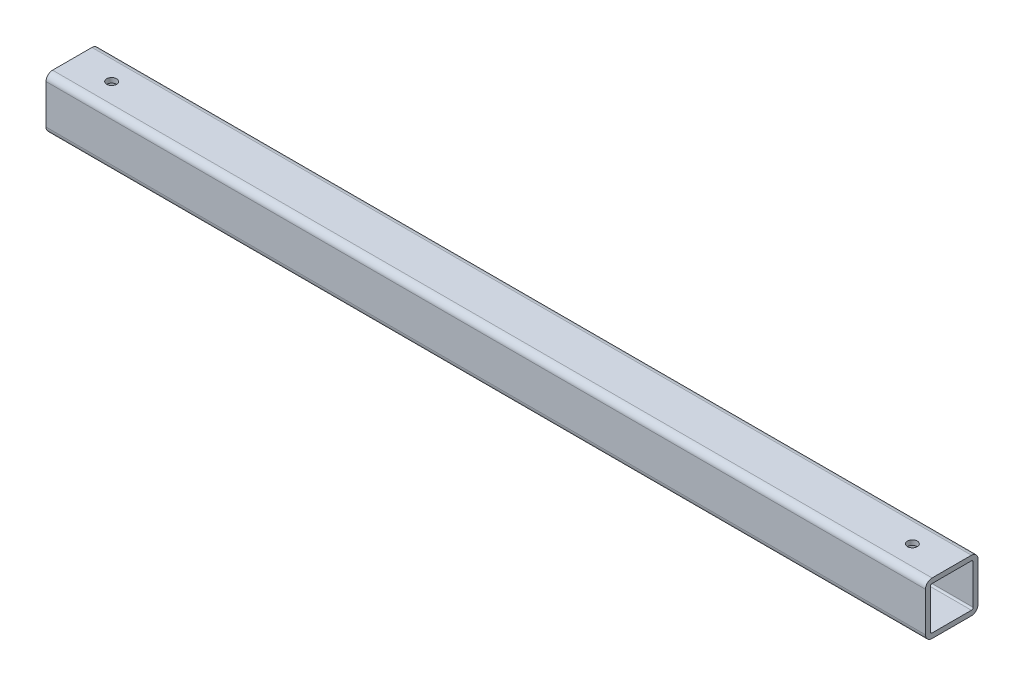
ISO-10303-21;
HEADER;
FILE_DESCRIPTION(('STEP AP214'),'2;1');
FILE_NAME('part.step','',(''),(''),'','','');
FILE_SCHEMA(('AUTOMOTIVE_DESIGN { 1 0 10303 214 1 1 1 1 }'));
ENDSEC;
DATA;
#1=APPLICATION_CONTEXT('core data for automotive mechanical design processes');
#2=APPLICATION_PROTOCOL_DEFINITION('international standard','automotive_design',2000,#1);
#3=PRODUCT_CONTEXT('',#1,'mechanical');
#4=PRODUCT('Part','Part','',(#3));
#5=PRODUCT_RELATED_PRODUCT_CATEGORY('part','',(#4));
#6=PRODUCT_DEFINITION_FORMATION('','',#4);
#7=PRODUCT_DEFINITION_CONTEXT('part definition',#1,'design');
#8=PRODUCT_DEFINITION('design','',#6,#7);
#9=PRODUCT_DEFINITION_SHAPE('','',#8);
#10=(LENGTH_UNIT() NAMED_UNIT(*) SI_UNIT(.MILLI.,.METRE.));
#11=(NAMED_UNIT(*) PLANE_ANGLE_UNIT() SI_UNIT($,.RADIAN.));
#12=(NAMED_UNIT(*) SI_UNIT($,.STERADIAN.) SOLID_ANGLE_UNIT());
#13=UNCERTAINTY_MEASURE_WITH_UNIT(LENGTH_MEASURE(1.E-05),#10,'distance_accuracy_value','');
#14=(GEOMETRIC_REPRESENTATION_CONTEXT(3) GLOBAL_UNCERTAINTY_ASSIGNED_CONTEXT((#13)) GLOBAL_UNIT_ASSIGNED_CONTEXT((#10,
#11,#12)) REPRESENTATION_CONTEXT('',''));
#15=CARTESIAN_POINT('',(0.,0.,0.));
#16=DIRECTION('',(0.,0.,1.));
#17=DIRECTION('',(1.,0.,0.));
#18=AXIS2_PLACEMENT_3D('',#15,#16,#17);
#19=CARTESIAN_POINT('',(850.9,6.35,6.35));
#20=DIRECTION('',(1.,0.,0.));
#21=DIRECTION('',(0.,0.,-1.));
#22=AXIS2_PLACEMENT_3D('',#19,#20,#21);
#23=PLANE('',#22);
#24=CARTESIAN_POINT('',(850.9,6.35,6.35));
#25=DIRECTION('',(1.,0.,0.));
#26=DIRECTION('',(0.,0.,-1.));
#27=AXIS2_PLACEMENT_3D('',#24,#25,#26);
#28=CIRCLE('',#27,6.35);
#29=CARTESIAN_POINT('',(850.9,0.,6.35000000000004));
#30=VERTEX_POINT('',#29);
#31=CARTESIAN_POINT('',(850.9,6.35000000000004,0.));
#32=VERTEX_POINT('',#31);
#33=EDGE_CURVE('E252',#30,#32,#28,.T.);
#34=ORIENTED_EDGE('',*,*,#33,.T.);
#35=DIRECTION('',(0.,1.,0.));
#36=VECTOR('',#35,1.);
#37=CARTESIAN_POINT('',(850.9,6.35000000000004,0.));
#38=LINE('',#37,#36);
#39=CARTESIAN_POINT('',(850.9,44.45,0.));
#40=VERTEX_POINT('',#39);
#41=EDGE_CURVE('E256',#32,#40,#38,.T.);
#42=ORIENTED_EDGE('',*,*,#41,.T.);
#43=CARTESIAN_POINT('',(850.9,44.45,6.35));
#44=DIRECTION('',(1.,0.,0.));
#45=DIRECTION('',(0.,0.,-1.));
#46=AXIS2_PLACEMENT_3D('',#43,#44,#45);
#47=CIRCLE('',#46,6.35);
#48=CARTESIAN_POINT('',(850.9,50.8,6.35000000000004));
#49=VERTEX_POINT('',#48);
#50=EDGE_CURVE('E260',#40,#49,#47,.T.);
#51=ORIENTED_EDGE('',*,*,#50,.T.);
#52=DIRECTION('',(0.,0.,1.));
#53=VECTOR('',#52,1.);
#54=CARTESIAN_POINT('',(850.9,50.8,6.35000000000004));
#55=LINE('',#54,#53);
#56=CARTESIAN_POINT('',(850.9,50.8,44.45));
#57=VERTEX_POINT('',#56);
#58=EDGE_CURVE('E263',#49,#57,#55,.T.);
#59=ORIENTED_EDGE('',*,*,#58,.T.);
#60=CARTESIAN_POINT('',(850.9,44.45,44.45));
#61=DIRECTION('',(1.,0.,0.));
#62=DIRECTION('',(0.,0.,-1.));
#63=AXIS2_PLACEMENT_3D('',#60,#61,#62);
#64=CIRCLE('',#63,6.35);
#65=CARTESIAN_POINT('',(850.9,44.4499999999999,50.8));
#66=VERTEX_POINT('',#65);
#67=EDGE_CURVE('E266',#57,#66,#64,.T.);
#68=ORIENTED_EDGE('',*,*,#67,.T.);
#69=DIRECTION('',(0.,-1.,0.));
#70=VECTOR('',#69,1.);
#71=CARTESIAN_POINT('',(850.9,6.35000000000004,50.8));
#72=LINE('',#71,#70);
#73=CARTESIAN_POINT('',(850.9,6.35,50.8));
#74=VERTEX_POINT('',#73);
#75=EDGE_CURVE('E269',#66,#74,#72,.T.);
#76=ORIENTED_EDGE('',*,*,#75,.T.);
#77=CARTESIAN_POINT('',(850.9,6.35,44.45));
#78=DIRECTION('',(1.,0.,0.));
#79=DIRECTION('',(0.,0.,1.));
#80=AXIS2_PLACEMENT_3D('',#77,#78,#79);
#81=CIRCLE('',#80,6.35);
#82=CARTESIAN_POINT('',(850.9,0.,44.45));
#83=VERTEX_POINT('',#82);
#84=EDGE_CURVE('E272',#74,#83,#81,.T.);
#85=ORIENTED_EDGE('',*,*,#84,.T.);
#86=DIRECTION('',(0.,0.,-1.));
#87=VECTOR('',#86,1.);
#88=CARTESIAN_POINT('',(850.9,0.,6.35000000000004));
#89=LINE('',#88,#87);
#90=EDGE_CURVE('E275',#83,#30,#89,.T.);
#91=ORIENTED_EDGE('',*,*,#90,.T.);
#92=EDGE_LOOP('',(#34,#42,#51,#59,#68,#76,#85,#91));
#93=FACE_BOUND('',#92,.T.);
#94=DIRECTION('',(0.,1.,0.));
#95=VECTOR('',#94,1.);
#96=CARTESIAN_POINT('',(850.9,6.35000000000004,4.699));
#97=LINE('',#96,#95);
#98=CARTESIAN_POINT('',(850.9,6.35000000000004,4.699));
#99=VERTEX_POINT('',#98);
#100=CARTESIAN_POINT('',(850.9,44.45,4.699));
#101=VERTEX_POINT('',#100);
#102=EDGE_CURVE('E170',#99,#101,#97,.T.);
#103=ORIENTED_EDGE('',*,*,#102,.F.);
#104=CARTESIAN_POINT('',(850.9,6.35,6.35));
#105=DIRECTION('',(1.,0.,0.));
#106=DIRECTION('',(0.,0.,-1.));
#107=AXIS2_PLACEMENT_3D('',#104,#105,#106);
#108=CIRCLE('',#107,1.651);
#109=CARTESIAN_POINT('',(850.9,4.699,6.35000000000004));
#110=VERTEX_POINT('',#109);
#111=EDGE_CURVE('E161',#110,#99,#108,.T.);
#112=ORIENTED_EDGE('',*,*,#111,.F.);
#113=DIRECTION('',(0.,0.,-1.));
#114=VECTOR('',#113,1.);
#115=CARTESIAN_POINT('',(850.9,4.699,6.35000000000004));
#116=LINE('',#115,#114);
#117=CARTESIAN_POINT('',(850.9,4.699,44.4499999999999));
#118=VERTEX_POINT('',#117);
#119=EDGE_CURVE('E203',#118,#110,#116,.T.);
#120=ORIENTED_EDGE('',*,*,#119,.F.);
#121=CARTESIAN_POINT('',(850.9,6.35,44.45));
#122=DIRECTION('',(1.,0.,0.));
#123=DIRECTION('',(0.,0.,1.));
#124=AXIS2_PLACEMENT_3D('',#121,#122,#123);
#125=CIRCLE('',#124,1.651);
#126=CARTESIAN_POINT('',(850.9,6.35,46.101));
#127=VERTEX_POINT('',#126);
#128=EDGE_CURVE('E200',#127,#118,#125,.T.);
#129=ORIENTED_EDGE('',*,*,#128,.F.);
#130=DIRECTION('',(0.,-1.,0.));
#131=VECTOR('',#130,1.);
#132=CARTESIAN_POINT('',(850.9,6.35000000000001,46.101));
#133=LINE('',#132,#131);
#134=CARTESIAN_POINT('',(850.9,44.4499999999999,46.101));
#135=VERTEX_POINT('',#134);
#136=EDGE_CURVE('E197',#135,#127,#133,.T.);
#137=ORIENTED_EDGE('',*,*,#136,.F.);
#138=CARTESIAN_POINT('',(850.9,44.45,44.45));
#139=DIRECTION('',(1.,0.,0.));
#140=DIRECTION('',(0.,0.,-1.));
#141=AXIS2_PLACEMENT_3D('',#138,#139,#140);
#142=CIRCLE('',#141,1.651);
#143=CARTESIAN_POINT('',(850.9,46.101,44.45));
#144=VERTEX_POINT('',#143);
#145=EDGE_CURVE('E194',#144,#135,#142,.T.);
#146=ORIENTED_EDGE('',*,*,#145,.F.);
#147=DIRECTION('',(0.,0.,1.));
#148=VECTOR('',#147,1.);
#149=CARTESIAN_POINT('',(850.9,46.101,6.35000000000004));
#150=LINE('',#149,#148);
#151=CARTESIAN_POINT('',(850.9,46.101,6.35000000000004));
#152=VERTEX_POINT('',#151);
#153=EDGE_CURVE('E188',#152,#144,#150,.T.);
#154=ORIENTED_EDGE('',*,*,#153,.F.);
#155=CARTESIAN_POINT('',(850.9,44.45,6.35));
#156=DIRECTION('',(1.,0.,0.));
#157=DIRECTION('',(0.,0.,-1.));
#158=AXIS2_PLACEMENT_3D('',#155,#156,#157);
#159=CIRCLE('',#158,1.651);
#160=EDGE_CURVE('E184',#101,#152,#159,.T.);
#161=ORIENTED_EDGE('',*,*,#160,.F.);
#162=EDGE_LOOP('',(#103,#112,#120,#129,#137,#146,#154,#161));
#163=FACE_BOUND('',#162,.T.);
#164=ADVANCED_FACE('F45',(#93,#163),#23,.T.);
#165=CARTESIAN_POINT('',(0.,6.35,6.35));
#166=DIRECTION('',(1.,0.,0.));
#167=DIRECTION('',(0.,0.,-1.));
#168=AXIS2_PLACEMENT_3D('',#165,#166,#167);
#169=PLANE('',#168);
#170=CARTESIAN_POINT('',(0.,6.35,6.35));
#171=DIRECTION('',(1.,0.,0.));
#172=DIRECTION('',(0.,0.,-1.));
#173=AXIS2_PLACEMENT_3D('',#170,#171,#172);
#174=CIRCLE('',#173,6.35);
#175=CARTESIAN_POINT('',(0.,0.,6.35000000000004));
#176=VERTEX_POINT('',#175);
#177=CARTESIAN_POINT('',(0.,6.35000000000004,0.));
#178=VERTEX_POINT('',#177);
#179=EDGE_CURVE('E179',#176,#178,#174,.T.);
#180=ORIENTED_EDGE('',*,*,#179,.F.);
#181=DIRECTION('',(0.,0.,-1.));
#182=VECTOR('',#181,1.);
#183=CARTESIAN_POINT('',(0.,0.,6.35000000000004));
#184=LINE('',#183,#182);
#185=CARTESIAN_POINT('',(0.,0.,44.45));
#186=VERTEX_POINT('',#185);
#187=EDGE_CURVE('E257',#186,#176,#184,.T.);
#188=ORIENTED_EDGE('',*,*,#187,.F.);
#189=CARTESIAN_POINT('',(0.,6.35,44.45));
#190=DIRECTION('',(1.,0.,0.));
#191=DIRECTION('',(0.,0.,1.));
#192=AXIS2_PLACEMENT_3D('',#189,#190,#191);
#193=CIRCLE('',#192,6.35);
#194=CARTESIAN_POINT('',(0.,6.35,50.8));
#195=VERTEX_POINT('',#194);
#196=EDGE_CURVE('E297',#195,#186,#193,.T.);
#197=ORIENTED_EDGE('',*,*,#196,.F.);
#198=DIRECTION('',(0.,-1.,0.));
#199=VECTOR('',#198,1.);
#200=CARTESIAN_POINT('',(0.,6.35000000000004,50.8));
#201=LINE('',#200,#199);
#202=CARTESIAN_POINT('',(0.,44.4499999999999,50.8));
#203=VERTEX_POINT('',#202);
#204=EDGE_CURVE('E294',#203,#195,#201,.T.);
#205=ORIENTED_EDGE('',*,*,#204,.F.);
#206=CARTESIAN_POINT('',(0.,44.45,44.45));
#207=DIRECTION('',(1.,0.,0.));
#208=DIRECTION('',(0.,0.,-1.));
#209=AXIS2_PLACEMENT_3D('',#206,#207,#208);
#210=CIRCLE('',#209,6.35);
#211=CARTESIAN_POINT('',(0.,50.8,44.45));
#212=VERTEX_POINT('',#211);
#213=EDGE_CURVE('E291',#212,#203,#210,.T.);
#214=ORIENTED_EDGE('',*,*,#213,.F.);
#215=DIRECTION('',(0.,0.,1.));
#216=VECTOR('',#215,1.);
#217=CARTESIAN_POINT('',(0.,50.8,6.35000000000004));
#218=LINE('',#217,#216);
#219=CARTESIAN_POINT('',(0.,50.8,6.35000000000004));
#220=VERTEX_POINT('',#219);
#221=EDGE_CURVE('E288',#220,#212,#218,.T.);
#222=ORIENTED_EDGE('',*,*,#221,.F.);
#223=CARTESIAN_POINT('',(0.,44.45,6.35));
#224=DIRECTION('',(1.,0.,0.));
#225=DIRECTION('',(0.,0.,-1.));
#226=AXIS2_PLACEMENT_3D('',#223,#224,#225);
#227=CIRCLE('',#226,6.35);
#228=CARTESIAN_POINT('',(0.,44.45,0.));
#229=VERTEX_POINT('',#228);
#230=EDGE_CURVE('E285',#229,#220,#227,.T.);
#231=ORIENTED_EDGE('',*,*,#230,.F.);
#232=DIRECTION('',(0.,1.,0.));
#233=VECTOR('',#232,1.);
#234=CARTESIAN_POINT('',(0.,6.35000000000004,0.));
#235=LINE('',#234,#233);
#236=EDGE_CURVE('E282',#178,#229,#235,.T.);
#237=ORIENTED_EDGE('',*,*,#236,.F.);
#238=EDGE_LOOP('',(#180,#188,#197,#205,#214,#222,#231,#237));
#239=FACE_BOUND('',#238,.T.);
#240=CARTESIAN_POINT('',(0.,6.35,6.35));
#241=DIRECTION('',(1.,0.,0.));
#242=DIRECTION('',(0.,0.,-1.));
#243=AXIS2_PLACEMENT_3D('',#240,#241,#242);
#244=CIRCLE('',#243,1.651);
#245=CARTESIAN_POINT('',(0.,4.699,6.35000000000004));
#246=VERTEX_POINT('',#245);
#247=CARTESIAN_POINT('',(0.,6.35000000000004,4.699));
#248=VERTEX_POINT('',#247);
#249=EDGE_CURVE('E71',#246,#248,#244,.T.);
#250=ORIENTED_EDGE('',*,*,#249,.T.);
#251=DIRECTION('',(0.,1.,0.));
#252=VECTOR('',#251,1.);
#253=CARTESIAN_POINT('',(0.,6.35000000000004,4.699));
#254=LINE('',#253,#252);
#255=CARTESIAN_POINT('',(0.,44.45,4.699));
#256=VERTEX_POINT('',#255);
#257=EDGE_CURVE('E177',#248,#256,#254,.T.);
#258=ORIENTED_EDGE('',*,*,#257,.T.);
#259=CARTESIAN_POINT('',(0.,44.45,6.35));
#260=DIRECTION('',(1.,0.,0.));
#261=DIRECTION('',(0.,0.,-1.));
#262=AXIS2_PLACEMENT_3D('',#259,#260,#261);
#263=CIRCLE('',#262,1.651);
#264=CARTESIAN_POINT('',(0.,46.101,6.35000000000004));
#265=VERTEX_POINT('',#264);
#266=EDGE_CURVE('E211',#256,#265,#263,.T.);
#267=ORIENTED_EDGE('',*,*,#266,.T.);
#268=DIRECTION('',(0.,0.,1.));
#269=VECTOR('',#268,1.);
#270=CARTESIAN_POINT('',(0.,46.101,6.35000000000004));
#271=LINE('',#270,#269);
#272=CARTESIAN_POINT('',(0.,46.101,44.45));
#273=VERTEX_POINT('',#272);
#274=EDGE_CURVE('E215',#265,#273,#271,.T.);
#275=ORIENTED_EDGE('',*,*,#274,.T.);
#276=CARTESIAN_POINT('',(0.,44.45,44.45));
#277=DIRECTION('',(1.,0.,0.));
#278=DIRECTION('',(0.,0.,-1.));
#279=AXIS2_PLACEMENT_3D('',#276,#277,#278);
#280=CIRCLE('',#279,1.651);
#281=CARTESIAN_POINT('',(0.,44.4499999999999,46.101));
#282=VERTEX_POINT('',#281);
#283=EDGE_CURVE('E219',#273,#282,#280,.T.);
#284=ORIENTED_EDGE('',*,*,#283,.T.);
#285=DIRECTION('',(0.,-1.,0.));
#286=VECTOR('',#285,1.);
#287=CARTESIAN_POINT('',(0.,6.35000000000001,46.101));
#288=LINE('',#287,#286);
#289=CARTESIAN_POINT('',(0.,6.35,46.101));
#290=VERTEX_POINT('',#289);
#291=EDGE_CURVE('E223',#282,#290,#288,.T.);
#292=ORIENTED_EDGE('',*,*,#291,.T.);
#293=CARTESIAN_POINT('',(0.,6.35,44.45));
#294=DIRECTION('',(1.,0.,0.));
#295=DIRECTION('',(0.,0.,1.));
#296=AXIS2_PLACEMENT_3D('',#293,#294,#295);
#297=CIRCLE('',#296,1.651);
#298=CARTESIAN_POINT('',(0.,4.699,44.45));
#299=VERTEX_POINT('',#298);
#300=EDGE_CURVE('E227',#290,#299,#297,.T.);
#301=ORIENTED_EDGE('',*,*,#300,.T.);
#302=DIRECTION('',(0.,0.,-1.));
#303=VECTOR('',#302,1.);
#304=CARTESIAN_POINT('',(0.,4.699,6.35000000000004));
#305=LINE('',#304,#303);
#306=EDGE_CURVE('E171',#299,#246,#305,.T.);
#307=ORIENTED_EDGE('',*,*,#306,.T.);
#308=EDGE_LOOP('',(#250,#258,#267,#275,#284,#292,#301,#307));
#309=FACE_BOUND('',#308,.T.);
#310=ADVANCED_FACE('F379',(#239,#309),#169,.F.);
#311=CARTESIAN_POINT('',(850.9,6.35,6.35));
#312=DIRECTION('',(-1.,0.,0.));
#313=DIRECTION('',(0.,0.,1.));
#314=AXIS2_PLACEMENT_3D('',#311,#312,#313);
#315=CYLINDRICAL_SURFACE('',#314,6.35);
#316=ORIENTED_EDGE('',*,*,#179,.T.);
#317=DIRECTION('',(-1.,0.,0.));
#318=VECTOR('',#317,1.);
#319=CARTESIAN_POINT('',(850.9,6.35000000000004,0.));
#320=LINE('',#319,#318);
#321=EDGE_CURVE('E11',#32,#178,#320,.T.);
#322=ORIENTED_EDGE('',*,*,#321,.F.);
#323=ORIENTED_EDGE('',*,*,#33,.F.);
#324=DIRECTION('',(-1.,0.,0.));
#325=VECTOR('',#324,1.);
#326=CARTESIAN_POINT('',(850.9,0.,6.35000000000004));
#327=LINE('',#326,#325);
#328=EDGE_CURVE('E278',#30,#176,#327,.T.);
#329=ORIENTED_EDGE('',*,*,#328,.T.);
#330=EDGE_LOOP('',(#316,#322,#323,#329));
#331=FACE_BOUND('',#330,.T.);
#332=ADVANCED_FACE('F47',(#331),#315,.T.);
#333=CARTESIAN_POINT('',(850.9,6.35000000000004,0.));
#334=DIRECTION('',(0.,0.,1.));
#335=DIRECTION('',(0.,-1.,0.));
#336=AXIS2_PLACEMENT_3D('',#333,#334,#335);
#337=PLANE('',#336);
#338=ORIENTED_EDGE('',*,*,#236,.T.);
#339=DIRECTION('',(-1.,0.,0.));
#340=VECTOR('',#339,1.);
#341=CARTESIAN_POINT('',(850.9,44.45,0.));
#342=LINE('',#341,#340);
#343=EDGE_CURVE('E55',#40,#229,#342,.T.);
#344=ORIENTED_EDGE('',*,*,#343,.F.);
#345=ORIENTED_EDGE('',*,*,#41,.F.);
#346=ORIENTED_EDGE('',*,*,#321,.T.);
#347=EDGE_LOOP('',(#338,#344,#345,#346));
#348=FACE_BOUND('',#347,.T.);
#349=ADVANCED_FACE('F410',(#348),#337,.F.);
#350=CARTESIAN_POINT('',(850.9,44.45,6.35));
#351=DIRECTION('',(-1.,0.,0.));
#352=DIRECTION('',(0.,0.,1.));
#353=AXIS2_PLACEMENT_3D('',#350,#351,#352);
#354=CYLINDRICAL_SURFACE('',#353,6.35);
#355=ORIENTED_EDGE('',*,*,#230,.T.);
#356=DIRECTION('',(-1.,0.,0.));
#357=VECTOR('',#356,1.);
#358=CARTESIAN_POINT('',(850.9,50.8,6.35000000000004));
#359=LINE('',#358,#357);
#360=EDGE_CURVE('E321',#49,#220,#359,.T.);
#361=ORIENTED_EDGE('',*,*,#360,.F.);
#362=ORIENTED_EDGE('',*,*,#50,.F.);
#363=ORIENTED_EDGE('',*,*,#343,.T.);
#364=EDGE_LOOP('',(#355,#361,#362,#363));
#365=FACE_BOUND('',#364,.T.);
#366=ADVANCED_FACE('F407',(#365),#354,.T.);
#367=CARTESIAN_POINT('',(850.9,50.8,6.35000000000004));
#368=DIRECTION('',(0.,-1.,0.));
#369=DIRECTION('',(0.,0.,-1.));
#370=AXIS2_PLACEMENT_3D('',#367,#368,#369);
#371=PLANE('',#370);
#372=CARTESIAN_POINT('',(812.8,50.8,25.4));
#373=DIRECTION('',(0.,1.,0.));
#374=DIRECTION('',(0.,0.,1.));
#375=AXIS2_PLACEMENT_3D('',#372,#373,#374);
#376=CIRCLE('',#375,4.76250000000001);
#377=CARTESIAN_POINT('',(812.8,50.8,30.1625));
#378=VERTEX_POINT('',#377);
#379=EDGE_CURVE('E331',#378,#378,#376,.T.);
#380=ORIENTED_EDGE('',*,*,#379,.F.);
#381=EDGE_LOOP('',(#380));
#382=FACE_BOUND('',#381,.T.);
#383=CARTESIAN_POINT('',(38.1,50.8,25.4));
#384=DIRECTION('',(0.,1.,0.));
#385=DIRECTION('',(0.,0.,1.));
#386=AXIS2_PLACEMENT_3D('',#383,#384,#385);
#387=CIRCLE('',#386,4.7625);
#388=CARTESIAN_POINT('',(38.1,50.8,30.1625));
#389=VERTEX_POINT('',#388);
#390=EDGE_CURVE('E340',#389,#389,#387,.T.);
#391=ORIENTED_EDGE('',*,*,#390,.F.);
#392=EDGE_LOOP('',(#391));
#393=FACE_BOUND('',#392,.T.);
#394=ORIENTED_EDGE('',*,*,#221,.T.);
#395=DIRECTION('',(-1.,0.,0.));
#396=VECTOR('',#395,1.);
#397=CARTESIAN_POINT('',(850.9,50.8,44.45));
#398=LINE('',#397,#396);
#399=EDGE_CURVE('E317',#57,#212,#398,.T.);
#400=ORIENTED_EDGE('',*,*,#399,.F.);
#401=ORIENTED_EDGE('',*,*,#58,.F.);
#402=ORIENTED_EDGE('',*,*,#360,.T.);
#403=EDGE_LOOP('',(#394,#400,#401,#402));
#404=FACE_BOUND('',#403,.T.);
#405=ADVANCED_FACE('F403',(#382,#393,#404),#371,.F.);
#406=CARTESIAN_POINT('',(850.9,44.45,44.45));
#407=DIRECTION('',(-1.,0.,0.));
#408=DIRECTION('',(0.,0.,1.));
#409=AXIS2_PLACEMENT_3D('',#406,#407,#408);
#410=CYLINDRICAL_SURFACE('',#409,6.35);
#411=ORIENTED_EDGE('',*,*,#213,.T.);
#412=DIRECTION('',(-1.,0.,0.));
#413=VECTOR('',#412,1.);
#414=CARTESIAN_POINT('',(850.9,44.4499999999999,50.8));
#415=LINE('',#414,#413);
#416=EDGE_CURVE('E313',#66,#203,#415,.T.);
#417=ORIENTED_EDGE('',*,*,#416,.F.);
#418=ORIENTED_EDGE('',*,*,#67,.F.);
#419=ORIENTED_EDGE('',*,*,#399,.T.);
#420=EDGE_LOOP('',(#411,#417,#418,#419));
#421=FACE_BOUND('',#420,.T.);
#422=ADVANCED_FACE('F399',(#421),#410,.T.);
#423=CARTESIAN_POINT('',(850.9,6.35000000000004,50.8));
#424=DIRECTION('',(0.,0.,-1.));
#425=DIRECTION('',(-1.,0.,0.));
#426=AXIS2_PLACEMENT_3D('',#423,#424,#425);
#427=PLANE('',#426);
#428=ORIENTED_EDGE('',*,*,#204,.T.);
#429=DIRECTION('',(-1.,0.,0.));
#430=VECTOR('',#429,1.);
#431=CARTESIAN_POINT('',(850.9,6.35,50.8));
#432=LINE('',#431,#430);
#433=EDGE_CURVE('E309',#74,#195,#432,.T.);
#434=ORIENTED_EDGE('',*,*,#433,.F.);
#435=ORIENTED_EDGE('',*,*,#75,.F.);
#436=ORIENTED_EDGE('',*,*,#416,.T.);
#437=EDGE_LOOP('',(#428,#434,#435,#436));
#438=FACE_BOUND('',#437,.T.);
#439=ADVANCED_FACE('F395',(#438),#427,.F.);
#440=CARTESIAN_POINT('',(850.9,6.35,44.45));
#441=DIRECTION('',(-1.,0.,0.));
#442=DIRECTION('',(0.,0.,1.));
#443=AXIS2_PLACEMENT_3D('',#440,#441,#442);
#444=CYLINDRICAL_SURFACE('',#443,6.35);
#445=ORIENTED_EDGE('',*,*,#196,.T.);
#446=DIRECTION('',(-1.,0.,0.));
#447=VECTOR('',#446,1.);
#448=CARTESIAN_POINT('',(850.9,0.,44.45));
#449=LINE('',#448,#447);
#450=EDGE_CURVE('E305',#83,#186,#449,.T.);
#451=ORIENTED_EDGE('',*,*,#450,.F.);
#452=ORIENTED_EDGE('',*,*,#84,.F.);
#453=ORIENTED_EDGE('',*,*,#433,.T.);
#454=EDGE_LOOP('',(#445,#451,#452,#453));
#455=FACE_BOUND('',#454,.T.);
#456=ADVANCED_FACE('F392',(#455),#444,.T.);
#457=CARTESIAN_POINT('',(850.9,0.,6.35000000000004));
#458=DIRECTION('',(0.,1.,0.));
#459=DIRECTION('',(0.,0.,1.));
#460=AXIS2_PLACEMENT_3D('',#457,#458,#459);
#461=PLANE('',#460);
#462=CARTESIAN_POINT('',(812.8,0.,25.4));
#463=DIRECTION('',(0.,1.,0.));
#464=DIRECTION('',(0.,0.,1.));
#465=AXIS2_PLACEMENT_3D('',#462,#463,#464);
#466=CIRCLE('',#465,4.76250000000001);
#467=CARTESIAN_POINT('',(812.8,0.,30.1625));
#468=VERTEX_POINT('',#467);
#469=EDGE_CURVE('E208',#468,#468,#466,.T.);
#470=ORIENTED_EDGE('',*,*,#469,.T.);
#471=EDGE_LOOP('',(#470));
#472=FACE_BOUND('',#471,.T.);
#473=CARTESIAN_POINT('',(38.1,0.,25.4));
#474=DIRECTION('',(0.,1.,0.));
#475=DIRECTION('',(0.,0.,1.));
#476=AXIS2_PLACEMENT_3D('',#473,#474,#475);
#477=CIRCLE('',#476,4.7625);
#478=CARTESIAN_POINT('',(38.1,0.,30.1625));
#479=VERTEX_POINT('',#478);
#480=EDGE_CURVE('E337',#479,#479,#477,.T.);
#481=ORIENTED_EDGE('',*,*,#480,.T.);
#482=EDGE_LOOP('',(#481));
#483=FACE_BOUND('',#482,.T.);
#484=ORIENTED_EDGE('',*,*,#187,.T.);
#485=ORIENTED_EDGE('',*,*,#328,.F.);
#486=ORIENTED_EDGE('',*,*,#90,.F.);
#487=ORIENTED_EDGE('',*,*,#450,.T.);
#488=EDGE_LOOP('',(#484,#485,#486,#487));
#489=FACE_BOUND('',#488,.T.);
#490=ADVANCED_FACE('F358',(#472,#483,#489),#461,.F.);
#491=CARTESIAN_POINT('',(850.9,6.35,6.35));
#492=DIRECTION('',(-1.,0.,0.));
#493=DIRECTION('',(0.,0.,1.));
#494=AXIS2_PLACEMENT_3D('',#491,#492,#493);
#495=CYLINDRICAL_SURFACE('',#494,1.651);
#496=ORIENTED_EDGE('',*,*,#249,.F.);
#497=DIRECTION('',(-1.,0.,0.));
#498=VECTOR('',#497,1.);
#499=CARTESIAN_POINT('',(850.9,4.699,6.35000000000004));
#500=LINE('',#499,#498);
#501=EDGE_CURVE('E165',#110,#246,#500,.T.);
#502=ORIENTED_EDGE('',*,*,#501,.F.);
#503=ORIENTED_EDGE('',*,*,#111,.T.);
#504=DIRECTION('',(-1.,0.,0.));
#505=VECTOR('',#504,1.);
#506=CARTESIAN_POINT('',(850.9,6.35000000000004,4.699));
#507=LINE('',#506,#505);
#508=EDGE_CURVE('E164',#99,#248,#507,.T.);
#509=ORIENTED_EDGE('',*,*,#508,.T.);
#510=EDGE_LOOP('',(#496,#502,#503,#509));
#511=FACE_BOUND('',#510,.T.);
#512=ADVANCED_FACE('F163',(#511),#495,.F.);
#513=CARTESIAN_POINT('',(850.9,6.35000000000004,4.699));
#514=DIRECTION('',(0.,0.,1.));
#515=DIRECTION('',(0.,-1.,0.));
#516=AXIS2_PLACEMENT_3D('',#513,#514,#515);
#517=PLANE('',#516);
#518=ORIENTED_EDGE('',*,*,#257,.F.);
#519=ORIENTED_EDGE('',*,*,#508,.F.);
#520=ORIENTED_EDGE('',*,*,#102,.T.);
#521=DIRECTION('',(-1.,0.,0.));
#522=VECTOR('',#521,1.);
#523=CARTESIAN_POINT('',(850.9,44.45,4.699));
#524=LINE('',#523,#522);
#525=EDGE_CURVE('E180',#101,#256,#524,.T.);
#526=ORIENTED_EDGE('',*,*,#525,.T.);
#527=EDGE_LOOP('',(#518,#519,#520,#526));
#528=FACE_BOUND('',#527,.T.);
#529=ADVANCED_FACE('F174',(#528),#517,.T.);
#530=CARTESIAN_POINT('',(850.9,44.45,6.35));
#531=DIRECTION('',(-1.,0.,0.));
#532=DIRECTION('',(0.,0.,1.));
#533=AXIS2_PLACEMENT_3D('',#530,#531,#532);
#534=CYLINDRICAL_SURFACE('',#533,1.651);
#535=ORIENTED_EDGE('',*,*,#266,.F.);
#536=ORIENTED_EDGE('',*,*,#525,.F.);
#537=ORIENTED_EDGE('',*,*,#160,.T.);
#538=DIRECTION('',(-1.,0.,0.));
#539=VECTOR('',#538,1.);
#540=CARTESIAN_POINT('',(850.9,46.101,6.35000000000004));
#541=LINE('',#540,#539);
#542=EDGE_CURVE('E247',#152,#265,#541,.T.);
#543=ORIENTED_EDGE('',*,*,#542,.T.);
#544=EDGE_LOOP('',(#535,#536,#537,#543));
#545=FACE_BOUND('',#544,.T.);
#546=ADVANCED_FACE('F464',(#545),#534,.F.);
#547=CARTESIAN_POINT('',(850.9,46.101,6.35000000000004));
#548=DIRECTION('',(0.,-1.,0.));
#549=DIRECTION('',(0.,0.,-1.));
#550=AXIS2_PLACEMENT_3D('',#547,#548,#549);
#551=PLANE('',#550);
#552=CARTESIAN_POINT('',(812.8,46.1009999999999,25.4));
#553=DIRECTION('',(0.,-1.,0.));
#554=DIRECTION('',(0.,0.,-1.));
#555=AXIS2_PLACEMENT_3D('',#552,#553,#554);
#556=CIRCLE('',#555,4.76250000000001);
#557=CARTESIAN_POINT('',(812.8,46.1009999999999,20.6375));
#558=VERTEX_POINT('',#557);
#559=EDGE_CURVE('E351',#558,#558,#556,.T.);
#560=ORIENTED_EDGE('',*,*,#559,.F.);
#561=EDGE_LOOP('',(#560));
#562=FACE_BOUND('',#561,.T.);
#563=CARTESIAN_POINT('',(38.1,46.1009999999999,25.4));
#564=DIRECTION('',(0.,-1.,0.));
#565=DIRECTION('',(0.,0.,-1.));
#566=AXIS2_PLACEMENT_3D('',#563,#564,#565);
#567=CIRCLE('',#566,4.7625);
#568=CARTESIAN_POINT('',(38.1,46.1009999999999,20.6375));
#569=VERTEX_POINT('',#568);
#570=EDGE_CURVE('E330',#569,#569,#567,.T.);
#571=ORIENTED_EDGE('',*,*,#570,.F.);
#572=EDGE_LOOP('',(#571));
#573=FACE_BOUND('',#572,.T.);
#574=ORIENTED_EDGE('',*,*,#274,.F.);
#575=ORIENTED_EDGE('',*,*,#542,.F.);
#576=ORIENTED_EDGE('',*,*,#153,.T.);
#577=DIRECTION('',(-1.,0.,0.));
#578=VECTOR('',#577,1.);
#579=CARTESIAN_POINT('',(850.9,46.101,44.45));
#580=LINE('',#579,#578);
#581=EDGE_CURVE('E244',#144,#273,#580,.T.);
#582=ORIENTED_EDGE('',*,*,#581,.T.);
#583=EDGE_LOOP('',(#574,#575,#576,#582));
#584=FACE_BOUND('',#583,.T.);
#585=ADVANCED_FACE('F461',(#562,#573,#584),#551,.T.);
#586=CARTESIAN_POINT('',(850.9,44.45,44.45));
#587=DIRECTION('',(-1.,0.,0.));
#588=DIRECTION('',(0.,0.,1.));
#589=AXIS2_PLACEMENT_3D('',#586,#587,#588);
#590=CYLINDRICAL_SURFACE('',#589,1.651);
#591=ORIENTED_EDGE('',*,*,#283,.F.);
#592=ORIENTED_EDGE('',*,*,#581,.F.);
#593=ORIENTED_EDGE('',*,*,#145,.T.);
#594=DIRECTION('',(-1.,0.,0.));
#595=VECTOR('',#594,1.);
#596=CARTESIAN_POINT('',(850.9,44.4499999999999,46.101));
#597=LINE('',#596,#595);
#598=EDGE_CURVE('E241',#135,#282,#597,.T.);
#599=ORIENTED_EDGE('',*,*,#598,.T.);
#600=EDGE_LOOP('',(#591,#592,#593,#599));
#601=FACE_BOUND('',#600,.T.);
#602=ADVANCED_FACE('F456',(#601),#590,.F.);
#603=CARTESIAN_POINT('',(850.9,6.35000000000001,46.101));
#604=DIRECTION('',(0.,0.,-1.));
#605=DIRECTION('',(0.,1.,0.));
#606=AXIS2_PLACEMENT_3D('',#603,#604,#605);
#607=PLANE('',#606);
#608=ORIENTED_EDGE('',*,*,#291,.F.);
#609=ORIENTED_EDGE('',*,*,#598,.F.);
#610=ORIENTED_EDGE('',*,*,#136,.T.);
#611=DIRECTION('',(-1.,0.,0.));
#612=VECTOR('',#611,1.);
#613=CARTESIAN_POINT('',(850.9,6.35,46.101));
#614=LINE('',#613,#612);
#615=EDGE_CURVE('E238',#127,#290,#614,.T.);
#616=ORIENTED_EDGE('',*,*,#615,.T.);
#617=EDGE_LOOP('',(#608,#609,#610,#616));
#618=FACE_BOUND('',#617,.T.);
#619=ADVANCED_FACE('F452',(#618),#607,.T.);
#620=CARTESIAN_POINT('',(850.9,6.35,44.45));
#621=DIRECTION('',(-1.,0.,0.));
#622=DIRECTION('',(0.,0.,1.));
#623=AXIS2_PLACEMENT_3D('',#620,#621,#622);
#624=CYLINDRICAL_SURFACE('',#623,1.651);
#625=ORIENTED_EDGE('',*,*,#300,.F.);
#626=ORIENTED_EDGE('',*,*,#615,.F.);
#627=ORIENTED_EDGE('',*,*,#128,.T.);
#628=DIRECTION('',(-1.,0.,0.));
#629=VECTOR('',#628,1.);
#630=CARTESIAN_POINT('',(850.9,4.699,44.45));
#631=LINE('',#630,#629);
#632=EDGE_CURVE('E63',#118,#299,#631,.T.);
#633=ORIENTED_EDGE('',*,*,#632,.T.);
#634=EDGE_LOOP('',(#625,#626,#627,#633));
#635=FACE_BOUND('',#634,.T.);
#636=ADVANCED_FACE('F449',(#635),#624,.F.);
#637=CARTESIAN_POINT('',(850.9,4.699,6.35000000000004));
#638=DIRECTION('',(0.,1.,0.));
#639=DIRECTION('',(0.,0.,1.));
#640=AXIS2_PLACEMENT_3D('',#637,#638,#639);
#641=PLANE('',#640);
#642=CARTESIAN_POINT('',(812.8,4.69900000000001,25.4));
#643=DIRECTION('',(0.,1.,0.));
#644=DIRECTION('',(0.,0.,1.));
#645=AXIS2_PLACEMENT_3D('',#642,#643,#644);
#646=CIRCLE('',#645,4.76250000000001);
#647=CARTESIAN_POINT('',(812.8,4.69900000000001,30.1625));
#648=VERTEX_POINT('',#647);
#649=EDGE_CURVE('E49',#648,#648,#646,.T.);
#650=ORIENTED_EDGE('',*,*,#649,.F.);
#651=EDGE_LOOP('',(#650));
#652=FACE_BOUND('',#651,.T.);
#653=CARTESIAN_POINT('',(38.1,4.69900000000001,25.4));
#654=DIRECTION('',(0.,1.,0.));
#655=DIRECTION('',(0.,0.,1.));
#656=AXIS2_PLACEMENT_3D('',#653,#654,#655);
#657=CIRCLE('',#656,4.7625);
#658=CARTESIAN_POINT('',(38.1,4.69900000000001,30.1625));
#659=VERTEX_POINT('',#658);
#660=EDGE_CURVE('E327',#659,#659,#657,.T.);
#661=ORIENTED_EDGE('',*,*,#660,.F.);
#662=EDGE_LOOP('',(#661));
#663=FACE_BOUND('',#662,.T.);
#664=ORIENTED_EDGE('',*,*,#306,.F.);
#665=ORIENTED_EDGE('',*,*,#632,.F.);
#666=ORIENTED_EDGE('',*,*,#119,.T.);
#667=ORIENTED_EDGE('',*,*,#501,.T.);
#668=EDGE_LOOP('',(#664,#665,#666,#667));
#669=FACE_BOUND('',#668,.T.);
#670=ADVANCED_FACE('F374',(#652,#663,#669),#641,.T.);
#671=CARTESIAN_POINT('',(38.1,-800.1,25.3999999999998));
#672=DIRECTION('',(0.,1.,0.));
#673=DIRECTION('',(0.,0.,1.));
#674=AXIS2_PLACEMENT_3D('',#671,#672,#673);
#675=CYLINDRICAL_SURFACE('',#674,4.7625);
#676=ORIENTED_EDGE('',*,*,#660,.T.);
#677=EDGE_LOOP('',(#676));
#678=FACE_BOUND('',#677,.T.);
#679=ORIENTED_EDGE('',*,*,#480,.F.);
#680=EDGE_LOOP('',(#679));
#681=FACE_BOUND('',#680,.T.);
#682=ADVANCED_FACE('F364',(#678,#681),#675,.F.);
#683=CARTESIAN_POINT('',(812.8,-800.1,25.3999999999998));
#684=DIRECTION('',(0.,1.,0.));
#685=DIRECTION('',(0.,0.,1.));
#686=AXIS2_PLACEMENT_3D('',#683,#684,#685);
#687=CYLINDRICAL_SURFACE('',#686,4.76250000000001);
#688=ORIENTED_EDGE('',*,*,#649,.T.);
#689=EDGE_LOOP('',(#688));
#690=FACE_BOUND('',#689,.T.);
#691=ORIENTED_EDGE('',*,*,#469,.F.);
#692=EDGE_LOOP('',(#691));
#693=FACE_BOUND('',#692,.T.);
#694=ADVANCED_FACE('F361',(#690,#693),#687,.F.);
#695=ORIENTED_EDGE('',*,*,#570,.T.);
#696=EDGE_LOOP('',(#695));
#697=FACE_BOUND('',#696,.T.);
#698=ORIENTED_EDGE('',*,*,#390,.T.);
#699=EDGE_LOOP('',(#698));
#700=FACE_BOUND('',#699,.T.);
#701=ADVANCED_FACE('F363',(#697,#700),#675,.F.);
#702=ORIENTED_EDGE('',*,*,#559,.T.);
#703=EDGE_LOOP('',(#702));
#704=FACE_BOUND('',#703,.T.);
#705=ORIENTED_EDGE('',*,*,#379,.T.);
#706=EDGE_LOOP('',(#705));
#707=FACE_BOUND('',#706,.T.);
#708=ADVANCED_FACE('F367',(#704,#707),#687,.F.);
#709=CLOSED_SHELL('',(#164,#310,#332,#349,#366,#405,#422,#439,#456,#490,#512,#529,#546,#585,
#602,#619,#636,#670,#682,#694,#701,#708));
#710=MANIFOLD_SOLID_BREP('B2',#709);
#711=ADVANCED_BREP_SHAPE_REPRESENTATION('',(#18,#710),#14);
#712=SHAPE_DEFINITION_REPRESENTATION(#9,#711);
ENDSEC;
END-ISO-10303-21;
